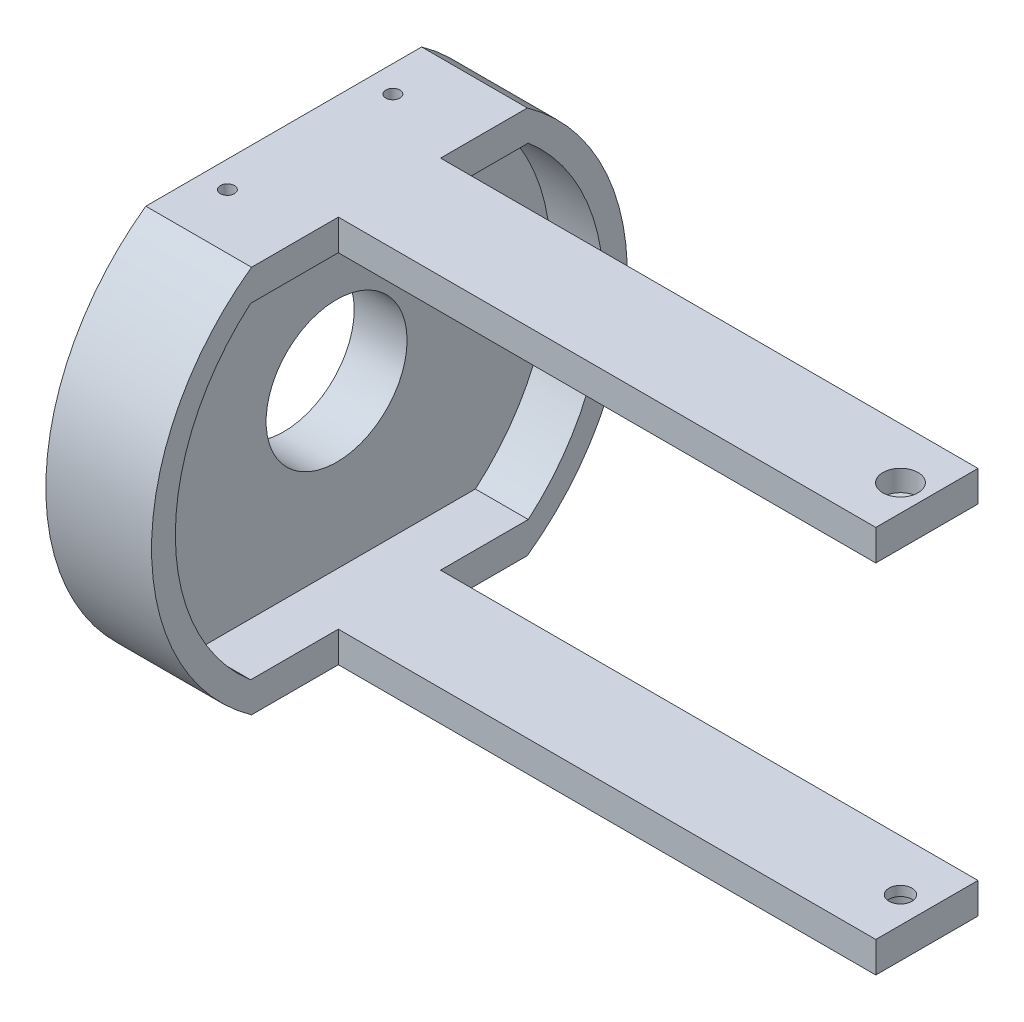
ISO-10303-21;
HEADER;
FILE_DESCRIPTION(('STEP AP214'),'2;1');
FILE_NAME('part.step','',(''),(''),'','','');
FILE_SCHEMA(('AUTOMOTIVE_DESIGN { 1 0 10303 214 1 1 1 1 }'));
ENDSEC;
DATA;
#1=APPLICATION_CONTEXT('core data for automotive mechanical design processes');
#2=APPLICATION_PROTOCOL_DEFINITION('international standard','automotive_design',2000,#1);
#3=PRODUCT_CONTEXT('',#1,'mechanical');
#4=PRODUCT('Part','Part','',(#3));
#5=PRODUCT_RELATED_PRODUCT_CATEGORY('part','',(#4));
#6=PRODUCT_DEFINITION_FORMATION('','',#4);
#7=PRODUCT_DEFINITION_CONTEXT('part definition',#1,'design');
#8=PRODUCT_DEFINITION('design','',#6,#7);
#9=PRODUCT_DEFINITION_SHAPE('','',#8);
#10=(LENGTH_UNIT() NAMED_UNIT(*) SI_UNIT(.MILLI.,.METRE.));
#11=(NAMED_UNIT(*) PLANE_ANGLE_UNIT() SI_UNIT($,.RADIAN.));
#12=(NAMED_UNIT(*) SI_UNIT($,.STERADIAN.) SOLID_ANGLE_UNIT());
#13=UNCERTAINTY_MEASURE_WITH_UNIT(LENGTH_MEASURE(1.E-05),#10,'distance_accuracy_value','');
#14=(GEOMETRIC_REPRESENTATION_CONTEXT(3) GLOBAL_UNCERTAINTY_ASSIGNED_CONTEXT((#13)) GLOBAL_UNIT_ASSIGNED_CONTEXT((#10,
#11,#12)) REPRESENTATION_CONTEXT('',''));
#15=CARTESIAN_POINT('',(0.,0.,0.));
#16=DIRECTION('',(0.,0.,1.));
#17=DIRECTION('',(1.,0.,0.));
#18=AXIS2_PLACEMENT_3D('',#15,#16,#17);
#19=CARTESIAN_POINT('',(6.,0.,0.));
#20=DIRECTION('',(1.,0.,0.));
#21=DIRECTION('',(0.,0.,-1.));
#22=AXIS2_PLACEMENT_3D('',#19,#20,#21);
#23=PLANE('',#22);
#24=DIRECTION('',(0.,0.,-1.));
#25=VECTOR('',#24,1.);
#26=CARTESIAN_POINT('',(6.,-11.,0.));
#27=LINE('',#26,#25);
#28=CARTESIAN_POINT('',(6.,-11.,7.82623792124926));
#29=VERTEX_POINT('',#28);
#30=CARTESIAN_POINT('',(6.,-11.,2.9));
#31=VERTEX_POINT('',#30);
#32=EDGE_CURVE('E265',#29,#31,#27,.T.);
#33=ORIENTED_EDGE('',*,*,#32,.T.);
#34=DIRECTION('',(0.,1.,0.));
#35=VECTOR('',#34,1.);
#36=CARTESIAN_POINT('',(6.,0.,2.9));
#37=LINE('',#36,#35);
#38=CARTESIAN_POINT('',(6.,-9.25,2.9));
#39=VERTEX_POINT('',#38);
#40=EDGE_CURVE('E80',#31,#39,#37,.T.);
#41=ORIENTED_EDGE('',*,*,#40,.T.);
#42=DIRECTION('',(0.,0.,-1.));
#43=VECTOR('',#42,1.);
#44=CARTESIAN_POINT('',(6.,-9.25,0.));
#45=LINE('',#44,#43);
#46=CARTESIAN_POINT('',(6.,-9.25,7.87781695649246));
#47=VERTEX_POINT('',#46);
#48=EDGE_CURVE('E191',#47,#39,#45,.T.);
#49=ORIENTED_EDGE('',*,*,#48,.F.);
#50=CARTESIAN_POINT('',(6.,0.,0.));
#51=DIRECTION('',(1.,0.,0.));
#52=DIRECTION('',(0.,0.,-1.));
#53=AXIS2_PLACEMENT_3D('',#50,#51,#52);
#54=CIRCLE('',#53,12.15);
#55=CARTESIAN_POINT('',(6.,9.25,7.87781695649245));
#56=VERTEX_POINT('',#55);
#57=EDGE_CURVE('E258',#56,#47,#54,.T.);
#58=ORIENTED_EDGE('',*,*,#57,.F.);
#59=DIRECTION('',(0.,0.,-1.));
#60=VECTOR('',#59,1.);
#61=CARTESIAN_POINT('',(6.,9.25,0.));
#62=LINE('',#61,#60);
#63=CARTESIAN_POINT('',(6.,9.25,2.9));
#64=VERTEX_POINT('',#63);
#65=EDGE_CURVE('E262',#56,#64,#62,.T.);
#66=ORIENTED_EDGE('',*,*,#65,.T.);
#67=DIRECTION('',(0.,-1.,0.));
#68=VECTOR('',#67,1.);
#69=CARTESIAN_POINT('',(6.,0.,2.9));
#70=LINE('',#69,#68);
#71=CARTESIAN_POINT('',(6.,11.,2.9));
#72=VERTEX_POINT('',#71);
#73=EDGE_CURVE('E94',#72,#64,#70,.T.);
#74=ORIENTED_EDGE('',*,*,#73,.F.);
#75=DIRECTION('',(0.,0.,1.));
#76=VECTOR('',#75,1.);
#77=CARTESIAN_POINT('',(6.,11.,0.));
#78=LINE('',#77,#76);
#79=CARTESIAN_POINT('',(6.,11.,7.82623792124926));
#80=VERTEX_POINT('',#79);
#81=EDGE_CURVE('E271',#72,#80,#78,.T.);
#82=ORIENTED_EDGE('',*,*,#81,.T.);
#83=CARTESIAN_POINT('',(6.,0.,0.));
#84=DIRECTION('',(1.,0.,0.));
#85=DIRECTION('',(0.,0.,-1.));
#86=AXIS2_PLACEMENT_3D('',#83,#84,#85);
#87=CIRCLE('',#86,13.5);
#88=EDGE_CURVE('E274',#80,#29,#87,.T.);
#89=ORIENTED_EDGE('',*,*,#88,.T.);
#90=EDGE_LOOP('',(#33,#41,#49,#58,#66,#74,#82,#89));
#91=FACE_BOUND('',#90,.T.);
#92=ADVANCED_FACE('F71',(#91),#23,.T.);
#93=CARTESIAN_POINT('',(35.,-27.7079490772959,0.));
#94=DIRECTION('',(0.,1.,0.));
#95=DIRECTION('',(0.,0.,1.));
#96=AXIS2_PLACEMENT_3D('',#93,#94,#95);
#97=CYLINDRICAL_SURFACE('',#96,0.649999999999997);
#98=CARTESIAN_POINT('',(35.,9.25,0.));
#99=DIRECTION('',(0.,1.,0.));
#100=DIRECTION('',(0.,0.,1.));
#101=AXIS2_PLACEMENT_3D('',#98,#99,#100);
#102=CIRCLE('',#101,0.649999999999997);
#103=CARTESIAN_POINT('',(35.,9.25,0.64999999999999));
#104=VERTEX_POINT('',#103);
#105=EDGE_CURVE('E230',#104,#104,#102,.F.);
#106=ORIENTED_EDGE('',*,*,#105,.T.);
#107=EDGE_LOOP('',(#106));
#108=FACE_BOUND('',#107,.T.);
#109=CARTESIAN_POINT('',(35.,9.8,0.));
#110=DIRECTION('',(0.,1.,0.));
#111=DIRECTION('',(0.,0.,1.));
#112=AXIS2_PLACEMENT_3D('',#109,#110,#111);
#113=CIRCLE('',#112,0.649999999999997);
#114=CARTESIAN_POINT('',(35.,9.8,0.64999999999999));
#115=VERTEX_POINT('',#114);
#116=EDGE_CURVE('E224',#115,#115,#113,.F.);
#117=ORIENTED_EDGE('',*,*,#116,.F.);
#118=EDGE_LOOP('',(#117));
#119=FACE_BOUND('',#118,.T.);
#120=ADVANCED_FACE('F399',(#108,#119),#97,.F.);
#121=CARTESIAN_POINT('',(3.,11.,0.));
#122=DIRECTION('',(0.,1.,0.));
#123=DIRECTION('',(0.,0.,1.));
#124=AXIS2_PLACEMENT_3D('',#121,#122,#123);
#125=PLANE('',#124);
#126=CARTESIAN_POINT('',(1.5,11.,4.69574275274956));
#127=DIRECTION('',(0.,1.,0.));
#128=DIRECTION('',(0.,0.,1.));
#129=AXIS2_PLACEMENT_3D('',#126,#127,#128);
#130=CIRCLE('',#129,0.4);
#131=CARTESIAN_POINT('',(1.5,11.,5.09574275274956));
#132=VERTEX_POINT('',#131);
#133=EDGE_CURVE('E443',#132,#132,#130,.T.);
#134=ORIENTED_EDGE('',*,*,#133,.F.);
#135=EDGE_LOOP('',(#134));
#136=FACE_BOUND('',#135,.T.);
#137=CARTESIAN_POINT('',(1.5,11.,-4.69574275274956));
#138=DIRECTION('',(0.,1.,0.));
#139=DIRECTION('',(0.,0.,1.));
#140=AXIS2_PLACEMENT_3D('',#137,#138,#139);
#141=CIRCLE('',#140,0.4);
#142=CARTESIAN_POINT('',(1.5,11.,-4.29574275274956));
#143=VERTEX_POINT('',#142);
#144=EDGE_CURVE('E447',#143,#143,#141,.T.);
#145=ORIENTED_EDGE('',*,*,#144,.F.);
#146=EDGE_LOOP('',(#145));
#147=FACE_BOUND('',#146,.T.);
#148=CARTESIAN_POINT('',(35.,11.,0.));
#149=DIRECTION('',(0.,1.,0.));
#150=DIRECTION('',(0.,0.,1.));
#151=AXIS2_PLACEMENT_3D('',#148,#149,#150);
#152=CIRCLE('',#151,0.999999999999998);
#153=CARTESIAN_POINT('',(35.,11.,0.999999999999991));
#154=VERTEX_POINT('',#153);
#155=EDGE_CURVE('E204',#154,#154,#152,.T.);
#156=ORIENTED_EDGE('',*,*,#155,.F.);
#157=EDGE_LOOP('',(#156));
#158=FACE_BOUND('',#157,.T.);
#159=ORIENTED_EDGE('',*,*,#81,.F.);
#160=DIRECTION('',(1.,0.,0.));
#161=VECTOR('',#160,1.);
#162=CARTESIAN_POINT('',(0.,11.,2.9));
#163=LINE('',#162,#161);
#164=CARTESIAN_POINT('',(36.5,11.,2.9));
#165=VERTEX_POINT('',#164);
#166=EDGE_CURVE('E242',#72,#165,#163,.T.);
#167=ORIENTED_EDGE('',*,*,#166,.T.);
#168=DIRECTION('',(0.,0.,-1.));
#169=VECTOR('',#168,1.);
#170=CARTESIAN_POINT('',(36.5,11.,2.9));
#171=LINE('',#170,#169);
#172=CARTESIAN_POINT('',(36.5,11.,-2.9));
#173=VERTEX_POINT('',#172);
#174=EDGE_CURVE('E239',#165,#173,#171,.T.);
#175=ORIENTED_EDGE('',*,*,#174,.T.);
#176=DIRECTION('',(1.,0.,0.));
#177=VECTOR('',#176,1.);
#178=CARTESIAN_POINT('',(0.,11.,-2.9));
#179=LINE('',#178,#177);
#180=CARTESIAN_POINT('',(6.,11.,-2.9));
#181=VERTEX_POINT('',#180);
#182=EDGE_CURVE('E237',#181,#173,#179,.T.);
#183=ORIENTED_EDGE('',*,*,#182,.F.);
#184=CARTESIAN_POINT('',(6.,11.,-7.82623792124926));
#185=VERTEX_POINT('',#184);
#186=EDGE_CURVE('E272',#185,#181,#78,.T.);
#187=ORIENTED_EDGE('',*,*,#186,.F.);
#188=DIRECTION('',(-1.,0.,0.));
#189=VECTOR('',#188,1.);
#190=CARTESIAN_POINT('',(3.,11.,-7.82623792124926));
#191=LINE('',#190,#189);
#192=CARTESIAN_POINT('',(0.,11.,-7.82623792124926));
#193=VERTEX_POINT('',#192);
#194=EDGE_CURVE('E299',#185,#193,#191,.T.);
#195=ORIENTED_EDGE('',*,*,#194,.T.);
#196=DIRECTION('',(0.,0.,-1.));
#197=VECTOR('',#196,1.);
#198=CARTESIAN_POINT('',(0.,11.,0.));
#199=LINE('',#198,#197);
#200=CARTESIAN_POINT('',(0.,11.,7.82623792124926));
#201=VERTEX_POINT('',#200);
#202=EDGE_CURVE('E303',#201,#193,#199,.T.);
#203=ORIENTED_EDGE('',*,*,#202,.F.);
#204=DIRECTION('',(-1.,0.,0.));
#205=VECTOR('',#204,1.);
#206=CARTESIAN_POINT('',(3.,11.,7.82623792124926));
#207=LINE('',#206,#205);
#208=EDGE_CURVE('E318',#80,#201,#207,.T.);
#209=ORIENTED_EDGE('',*,*,#208,.F.);
#210=EDGE_LOOP('',(#159,#167,#175,#183,#187,#195,#203,#209));
#211=FACE_BOUND('',#210,.T.);
#212=ADVANCED_FACE('F367',(#136,#147,#158,#211),#125,.T.);
#213=CARTESIAN_POINT('',(3.,0.,0.));
#214=DIRECTION('',(-1.,0.,0.));
#215=DIRECTION('',(0.,0.,1.));
#216=AXIS2_PLACEMENT_3D('',#213,#214,#215);
#217=CYLINDRICAL_SURFACE('',#216,13.5);
#218=CARTESIAN_POINT('',(0.,0.,0.));
#219=DIRECTION('',(1.,0.,0.));
#220=DIRECTION('',(0.,0.,-1.));
#221=AXIS2_PLACEMENT_3D('',#218,#219,#220);
#222=CIRCLE('',#221,13.5);
#223=CARTESIAN_POINT('',(0.,-11.,7.82623792124926));
#224=VERTEX_POINT('',#223);
#225=EDGE_CURVE('E305',#201,#224,#222,.T.);
#226=ORIENTED_EDGE('',*,*,#225,.T.);
#227=DIRECTION('',(-1.,0.,0.));
#228=VECTOR('',#227,1.);
#229=CARTESIAN_POINT('',(3.,-11.,7.82623792124926));
#230=LINE('',#229,#228);
#231=EDGE_CURVE('E315',#29,#224,#230,.T.);
#232=ORIENTED_EDGE('',*,*,#231,.F.);
#233=ORIENTED_EDGE('',*,*,#88,.F.);
#234=ORIENTED_EDGE('',*,*,#208,.T.);
#235=EDGE_LOOP('',(#226,#232,#233,#234));
#236=FACE_BOUND('',#235,.T.);
#237=ADVANCED_FACE('F373',(#236),#217,.T.);
#238=CARTESIAN_POINT('',(3.,-11.,0.));
#239=DIRECTION('',(0.,1.,0.));
#240=DIRECTION('',(0.,0.,1.));
#241=AXIS2_PLACEMENT_3D('',#238,#239,#240);
#242=PLANE('',#241);
#243=CARTESIAN_POINT('',(35.,-11.,0.));
#244=DIRECTION('',(0.,1.,0.));
#245=DIRECTION('',(0.,0.,1.));
#246=AXIS2_PLACEMENT_3D('',#243,#244,#245);
#247=CIRCLE('',#246,0.999999999999998);
#248=CARTESIAN_POINT('',(35.,-11.,0.999999999999991));
#249=VERTEX_POINT('',#248);
#250=EDGE_CURVE('E495',#249,#249,#247,.T.);
#251=ORIENTED_EDGE('',*,*,#250,.T.);
#252=EDGE_LOOP('',(#251));
#253=FACE_BOUND('',#252,.T.);
#254=CARTESIAN_POINT('',(6.,-11.,-2.9));
#255=VERTEX_POINT('',#254);
#256=CARTESIAN_POINT('',(6.,-11.,-7.82623792124926));
#257=VERTEX_POINT('',#256);
#258=EDGE_CURVE('E264',#255,#257,#27,.T.);
#259=ORIENTED_EDGE('',*,*,#258,.F.);
#260=DIRECTION('',(1.,0.,0.));
#261=VECTOR('',#260,1.);
#262=CARTESIAN_POINT('',(3.,-11.,-2.9));
#263=LINE('',#262,#261);
#264=CARTESIAN_POINT('',(36.5,-11.,-2.9));
#265=VERTEX_POINT('',#264);
#266=EDGE_CURVE('E194',#255,#265,#263,.T.);
#267=ORIENTED_EDGE('',*,*,#266,.T.);
#268=DIRECTION('',(0.,0.,-1.));
#269=VECTOR('',#268,1.);
#270=CARTESIAN_POINT('',(36.5,-11.,0.));
#271=LINE('',#270,#269);
#272=CARTESIAN_POINT('',(36.5,-11.,2.9));
#273=VERTEX_POINT('',#272);
#274=EDGE_CURVE('E215',#273,#265,#271,.T.);
#275=ORIENTED_EDGE('',*,*,#274,.F.);
#276=DIRECTION('',(1.,0.,0.));
#277=VECTOR('',#276,1.);
#278=CARTESIAN_POINT('',(3.,-11.,2.9));
#279=LINE('',#278,#277);
#280=EDGE_CURVE('E200',#31,#273,#279,.T.);
#281=ORIENTED_EDGE('',*,*,#280,.F.);
#282=ORIENTED_EDGE('',*,*,#32,.F.);
#283=ORIENTED_EDGE('',*,*,#231,.T.);
#284=DIRECTION('',(0.,0.,-1.));
#285=VECTOR('',#284,1.);
#286=CARTESIAN_POINT('',(0.,-11.,0.));
#287=LINE('',#286,#285);
#288=CARTESIAN_POINT('',(0.,-11.,-7.82623792124926));
#289=VERTEX_POINT('',#288);
#290=EDGE_CURVE('E308',#224,#289,#287,.T.);
#291=ORIENTED_EDGE('',*,*,#290,.T.);
#292=DIRECTION('',(-1.,0.,0.));
#293=VECTOR('',#292,1.);
#294=CARTESIAN_POINT('',(3.,-11.,-7.82623792124926));
#295=LINE('',#294,#293);
#296=EDGE_CURVE('E312',#257,#289,#295,.T.);
#297=ORIENTED_EDGE('',*,*,#296,.F.);
#298=EDGE_LOOP('',(#259,#267,#275,#281,#282,#283,#291,#297));
#299=FACE_BOUND('',#298,.T.);
#300=ADVANCED_FACE('F330',(#253,#299),#242,.F.);
#301=CARTESIAN_POINT('',(3.,0.,0.));
#302=DIRECTION('',(-1.,0.,0.));
#303=DIRECTION('',(0.,0.,1.));
#304=AXIS2_PLACEMENT_3D('',#301,#302,#303);
#305=CYLINDRICAL_SURFACE('',#304,4.);
#306=CARTESIAN_POINT('',(3.,0.,0.));
#307=DIRECTION('',(1.,0.,0.));
#308=DIRECTION('',(0.,0.,-1.));
#309=AXIS2_PLACEMENT_3D('',#306,#307,#308);
#310=CIRCLE('',#309,4.);
#311=CARTESIAN_POINT('',(3.,0.,-4.));
#312=VERTEX_POINT('',#311);
#313=EDGE_CURVE('E296',#312,#312,#310,.T.);
#314=ORIENTED_EDGE('',*,*,#313,.T.);
#315=EDGE_LOOP('',(#314));
#316=FACE_BOUND('',#315,.T.);
#317=CARTESIAN_POINT('',(0.,0.,0.));
#318=DIRECTION('',(1.,0.,0.));
#319=DIRECTION('',(0.,0.,-1.));
#320=AXIS2_PLACEMENT_3D('',#317,#318,#319);
#321=CIRCLE('',#320,4.);
#322=CARTESIAN_POINT('',(0.,0.,-4.));
#323=VERTEX_POINT('',#322);
#324=EDGE_CURVE('E295',#323,#323,#321,.T.);
#325=ORIENTED_EDGE('',*,*,#324,.F.);
#326=EDGE_LOOP('',(#325));
#327=FACE_BOUND('',#326,.T.);
#328=ADVANCED_FACE('F73',(#316,#327),#305,.F.);
#329=EDGE_CURVE('E300',#289,#193,#222,.T.);
#330=ORIENTED_EDGE('',*,*,#329,.T.);
#331=ORIENTED_EDGE('',*,*,#194,.F.);
#332=CARTESIAN_POINT('',(6.,0.,0.));
#333=DIRECTION('',(1.,0.,0.));
#334=DIRECTION('',(0.,0.,-1.));
#335=AXIS2_PLACEMENT_3D('',#332,#333,#334);
#336=CIRCLE('',#335,13.5);
#337=EDGE_CURVE('E268',#257,#185,#336,.T.);
#338=ORIENTED_EDGE('',*,*,#337,.F.);
#339=ORIENTED_EDGE('',*,*,#296,.T.);
#340=EDGE_LOOP('',(#330,#331,#338,#339));
#341=FACE_BOUND('',#340,.T.);
#342=ADVANCED_FACE('F381',(#341),#217,.T.);
#343=CARTESIAN_POINT('',(3.,0.,0.));
#344=DIRECTION('',(1.,0.,0.));
#345=DIRECTION('',(0.,0.,-1.));
#346=AXIS2_PLACEMENT_3D('',#343,#344,#345);
#347=PLANE('',#346);
#348=CARTESIAN_POINT('',(3.,0.,0.));
#349=DIRECTION('',(1.,0.,0.));
#350=DIRECTION('',(0.,0.,-1.));
#351=AXIS2_PLACEMENT_3D('',#348,#349,#350);
#352=CIRCLE('',#351,12.15);
#353=CARTESIAN_POINT('',(3.,-9.25,-7.87781695649246));
#354=VERTEX_POINT('',#353);
#355=CARTESIAN_POINT('',(3.,9.25,-7.87781695649245));
#356=VERTEX_POINT('',#355);
#357=EDGE_CURVE('E251',#354,#356,#352,.T.);
#358=ORIENTED_EDGE('',*,*,#357,.T.);
#359=DIRECTION('',(0.,0.,-1.));
#360=VECTOR('',#359,1.);
#361=CARTESIAN_POINT('',(3.,9.25,0.));
#362=LINE('',#361,#360);
#363=CARTESIAN_POINT('',(3.,9.25,7.87781695649245));
#364=VERTEX_POINT('',#363);
#365=EDGE_CURVE('E256',#364,#356,#362,.T.);
#366=ORIENTED_EDGE('',*,*,#365,.F.);
#367=CARTESIAN_POINT('',(3.,0.,0.));
#368=DIRECTION('',(1.,0.,0.));
#369=DIRECTION('',(0.,0.,-1.));
#370=AXIS2_PLACEMENT_3D('',#367,#368,#369);
#371=CIRCLE('',#370,12.15);
#372=CARTESIAN_POINT('',(3.,-9.25,7.87781695649246));
#373=VERTEX_POINT('',#372);
#374=EDGE_CURVE('E282',#364,#373,#371,.T.);
#375=ORIENTED_EDGE('',*,*,#374,.T.);
#376=DIRECTION('',(0.,0.,-1.));
#377=VECTOR('',#376,1.);
#378=CARTESIAN_POINT('',(3.,-9.25,0.));
#379=LINE('',#378,#377);
#380=EDGE_CURVE('E280',#373,#354,#379,.T.);
#381=ORIENTED_EDGE('',*,*,#380,.T.);
#382=EDGE_LOOP('',(#358,#366,#375,#381));
#383=FACE_BOUND('',#382,.T.);
#384=ORIENTED_EDGE('',*,*,#313,.F.);
#385=EDGE_LOOP('',(#384));
#386=FACE_BOUND('',#385,.T.);
#387=ADVANCED_FACE('F347',(#383,#386),#347,.T.);
#388=CARTESIAN_POINT('',(0.,0.,0.));
#389=DIRECTION('',(1.,0.,0.));
#390=DIRECTION('',(0.,0.,-1.));
#391=AXIS2_PLACEMENT_3D('',#388,#389,#390);
#392=PLANE('',#391);
#393=ORIENTED_EDGE('',*,*,#324,.T.);
#394=EDGE_LOOP('',(#393));
#395=FACE_BOUND('',#394,.T.);
#396=ORIENTED_EDGE('',*,*,#329,.F.);
#397=ORIENTED_EDGE('',*,*,#290,.F.);
#398=ORIENTED_EDGE('',*,*,#225,.F.);
#399=ORIENTED_EDGE('',*,*,#202,.T.);
#400=EDGE_LOOP('',(#396,#397,#398,#399));
#401=FACE_BOUND('',#400,.T.);
#402=ADVANCED_FACE('F379',(#395,#401),#392,.F.);
#403=CARTESIAN_POINT('',(6.,0.,0.));
#404=DIRECTION('',(-1.,0.,0.));
#405=DIRECTION('',(0.,0.,1.));
#406=AXIS2_PLACEMENT_3D('',#403,#404,#405);
#407=CYLINDRICAL_SURFACE('',#406,12.15);
#408=ORIENTED_EDGE('',*,*,#357,.F.);
#409=DIRECTION('',(-1.,0.,0.));
#410=VECTOR('',#409,1.);
#411=CARTESIAN_POINT('',(6.,-9.25,-7.87781695649246));
#412=LINE('',#411,#410);
#413=CARTESIAN_POINT('',(6.,-9.25,-7.87781695649246));
#414=VERTEX_POINT('',#413);
#415=EDGE_CURVE('E293',#414,#354,#412,.T.);
#416=ORIENTED_EDGE('',*,*,#415,.F.);
#417=CARTESIAN_POINT('',(6.,0.,0.));
#418=DIRECTION('',(1.,0.,0.));
#419=DIRECTION('',(0.,0.,-1.));
#420=AXIS2_PLACEMENT_3D('',#417,#418,#419);
#421=CIRCLE('',#420,12.15);
#422=CARTESIAN_POINT('',(6.,9.25,-7.87781695649245));
#423=VERTEX_POINT('',#422);
#424=EDGE_CURVE('E252',#414,#423,#421,.T.);
#425=ORIENTED_EDGE('',*,*,#424,.T.);
#426=DIRECTION('',(-1.,0.,0.));
#427=VECTOR('',#426,1.);
#428=CARTESIAN_POINT('',(6.,9.25,-7.87781695649245));
#429=LINE('',#428,#427);
#430=EDGE_CURVE('E277',#423,#356,#429,.T.);
#431=ORIENTED_EDGE('',*,*,#430,.T.);
#432=EDGE_LOOP('',(#408,#416,#425,#431));
#433=FACE_BOUND('',#432,.T.);
#434=ADVANCED_FACE('F343',(#433),#407,.F.);
#435=CARTESIAN_POINT('',(6.,-9.25,0.));
#436=DIRECTION('',(0.,1.,0.));
#437=DIRECTION('',(0.,0.,1.));
#438=AXIS2_PLACEMENT_3D('',#435,#436,#437);
#439=PLANE('',#438);
#440=ORIENTED_EDGE('',*,*,#415,.T.);
#441=ORIENTED_EDGE('',*,*,#380,.F.);
#442=DIRECTION('',(-1.,0.,0.));
#443=VECTOR('',#442,1.);
#444=CARTESIAN_POINT('',(6.,-9.25,7.87781695649246));
#445=LINE('',#444,#443);
#446=EDGE_CURVE('E291',#47,#373,#445,.T.);
#447=ORIENTED_EDGE('',*,*,#446,.F.);
#448=ORIENTED_EDGE('',*,*,#48,.T.);
#449=DIRECTION('',(1.,0.,0.));
#450=VECTOR('',#449,1.);
#451=CARTESIAN_POINT('',(3.,-9.25,2.9));
#452=LINE('',#451,#450);
#453=CARTESIAN_POINT('',(36.5,-9.25,2.9));
#454=VERTEX_POINT('',#453);
#455=EDGE_CURVE('E182',#39,#454,#452,.T.);
#456=ORIENTED_EDGE('',*,*,#455,.T.);
#457=DIRECTION('',(0.,0.,-1.));
#458=VECTOR('',#457,1.);
#459=CARTESIAN_POINT('',(36.5,-9.25,0.));
#460=LINE('',#459,#458);
#461=CARTESIAN_POINT('',(36.5,-9.25,-2.9));
#462=VERTEX_POINT('',#461);
#463=EDGE_CURVE('E188',#454,#462,#460,.T.);
#464=ORIENTED_EDGE('',*,*,#463,.T.);
#465=DIRECTION('',(1.,0.,0.));
#466=VECTOR('',#465,1.);
#467=CARTESIAN_POINT('',(3.,-9.25,-2.9));
#468=LINE('',#467,#466);
#469=CARTESIAN_POINT('',(6.,-9.25,-2.9));
#470=VERTEX_POINT('',#469);
#471=EDGE_CURVE('E87',#470,#462,#468,.T.);
#472=ORIENTED_EDGE('',*,*,#471,.F.);
#473=EDGE_CURVE('E255',#470,#414,#45,.T.);
#474=ORIENTED_EDGE('',*,*,#473,.T.);
#475=EDGE_LOOP('',(#440,#441,#447,#448,#456,#464,#472,#474));
#476=FACE_BOUND('',#475,.T.);
#477=CARTESIAN_POINT('',(35.,-9.25,0.));
#478=DIRECTION('',(0.,1.,0.));
#479=DIRECTION('',(0.,0.,1.));
#480=AXIS2_PLACEMENT_3D('',#477,#478,#479);
#481=CIRCLE('',#480,0.649999999999997);
#482=CARTESIAN_POINT('',(35.,-9.25,0.64999999999999));
#483=VERTEX_POINT('',#482);
#484=EDGE_CURVE('E210',#483,#483,#481,.T.);
#485=ORIENTED_EDGE('',*,*,#484,.F.);
#486=EDGE_LOOP('',(#485));
#487=FACE_BOUND('',#486,.T.);
#488=ADVANCED_FACE('F185',(#476,#487),#439,.T.);
#489=CARTESIAN_POINT('',(6.,0.,0.));
#490=DIRECTION('',(-1.,0.,0.));
#491=DIRECTION('',(0.,0.,1.));
#492=AXIS2_PLACEMENT_3D('',#489,#490,#491);
#493=CYLINDRICAL_SURFACE('',#492,12.15);
#494=ORIENTED_EDGE('',*,*,#374,.F.);
#495=DIRECTION('',(-1.,0.,0.));
#496=VECTOR('',#495,1.);
#497=CARTESIAN_POINT('',(6.,9.25,7.87781695649245));
#498=LINE('',#497,#496);
#499=EDGE_CURVE('E288',#56,#364,#498,.T.);
#500=ORIENTED_EDGE('',*,*,#499,.F.);
#501=ORIENTED_EDGE('',*,*,#57,.T.);
#502=ORIENTED_EDGE('',*,*,#446,.T.);
#503=EDGE_LOOP('',(#494,#500,#501,#502));
#504=FACE_BOUND('',#503,.T.);
#505=ADVANCED_FACE('F350',(#504),#493,.F.);
#506=CARTESIAN_POINT('',(6.,9.25,0.));
#507=DIRECTION('',(0.,1.,0.));
#508=DIRECTION('',(0.,0.,1.));
#509=AXIS2_PLACEMENT_3D('',#506,#507,#508);
#510=PLANE('',#509);
#511=ORIENTED_EDGE('',*,*,#365,.T.);
#512=ORIENTED_EDGE('',*,*,#430,.F.);
#513=CARTESIAN_POINT('',(6.,9.25,-2.9));
#514=VERTEX_POINT('',#513);
#515=EDGE_CURVE('E261',#514,#423,#62,.T.);
#516=ORIENTED_EDGE('',*,*,#515,.F.);
#517=DIRECTION('',(-1.,0.,0.));
#518=VECTOR('',#517,1.);
#519=CARTESIAN_POINT('',(0.,9.25,-2.9));
#520=LINE('',#519,#518);
#521=CARTESIAN_POINT('',(36.5,9.25,-2.9));
#522=VERTEX_POINT('',#521);
#523=EDGE_CURVE('E231',#522,#514,#520,.T.);
#524=ORIENTED_EDGE('',*,*,#523,.F.);
#525=DIRECTION('',(0.,0.,1.));
#526=VECTOR('',#525,1.);
#527=CARTESIAN_POINT('',(36.5,9.25,2.9));
#528=LINE('',#527,#526);
#529=CARTESIAN_POINT('',(36.5,9.25,2.9));
#530=VERTEX_POINT('',#529);
#531=EDGE_CURVE('E232',#522,#530,#528,.T.);
#532=ORIENTED_EDGE('',*,*,#531,.T.);
#533=DIRECTION('',(-1.,0.,0.));
#534=VECTOR('',#533,1.);
#535=CARTESIAN_POINT('',(0.,9.25,2.9));
#536=LINE('',#535,#534);
#537=EDGE_CURVE('E227',#530,#64,#536,.T.);
#538=ORIENTED_EDGE('',*,*,#537,.T.);
#539=ORIENTED_EDGE('',*,*,#65,.F.);
#540=ORIENTED_EDGE('',*,*,#499,.T.);
#541=EDGE_LOOP('',(#511,#512,#516,#524,#532,#538,#539,#540));
#542=FACE_BOUND('',#541,.T.);
#543=ORIENTED_EDGE('',*,*,#105,.F.);
#544=EDGE_LOOP('',(#543));
#545=FACE_BOUND('',#544,.T.);
#546=ADVANCED_FACE('F357',(#542,#545),#510,.F.);
#547=DIRECTION('',(0.,1.,0.));
#548=VECTOR('',#547,1.);
#549=CARTESIAN_POINT('',(6.,0.,-2.9));
#550=LINE('',#549,#548);
#551=EDGE_CURVE('E12',#255,#470,#550,.T.);
#552=ORIENTED_EDGE('',*,*,#551,.F.);
#553=ORIENTED_EDGE('',*,*,#258,.T.);
#554=ORIENTED_EDGE('',*,*,#337,.T.);
#555=ORIENTED_EDGE('',*,*,#186,.T.);
#556=DIRECTION('',(0.,-1.,0.));
#557=VECTOR('',#556,1.);
#558=CARTESIAN_POINT('',(6.,0.,-2.9));
#559=LINE('',#558,#557);
#560=EDGE_CURVE('E320',#181,#514,#559,.T.);
#561=ORIENTED_EDGE('',*,*,#560,.T.);
#562=ORIENTED_EDGE('',*,*,#515,.T.);
#563=ORIENTED_EDGE('',*,*,#424,.F.);
#564=ORIENTED_EDGE('',*,*,#473,.F.);
#565=EDGE_LOOP('',(#552,#553,#554,#555,#561,#562,#563,#564));
#566=FACE_BOUND('',#565,.T.);
#567=ADVANCED_FACE('F338',(#566),#23,.T.);
#568=CARTESIAN_POINT('',(0.,-27.7079490772959,2.9));
#569=DIRECTION('',(0.,0.,1.));
#570=DIRECTION('',(1.,0.,0.));
#571=AXIS2_PLACEMENT_3D('',#568,#569,#570);
#572=PLANE('',#571);
#573=ORIENTED_EDGE('',*,*,#166,.F.);
#574=ORIENTED_EDGE('',*,*,#73,.T.);
#575=ORIENTED_EDGE('',*,*,#537,.F.);
#576=DIRECTION('',(0.,1.,0.));
#577=VECTOR('',#576,1.);
#578=CARTESIAN_POINT('',(36.5,-27.7079490772959,2.9));
#579=LINE('',#578,#577);
#580=EDGE_CURVE('E244',#530,#165,#579,.T.);
#581=ORIENTED_EDGE('',*,*,#580,.T.);
#582=EDGE_LOOP('',(#573,#574,#575,#581));
#583=FACE_BOUND('',#582,.T.);
#584=ADVANCED_FACE('F356',(#583),#572,.T.);
#585=CARTESIAN_POINT('',(36.5,-27.7079490772959,2.9));
#586=DIRECTION('',(1.,0.,0.));
#587=DIRECTION('',(0.,0.,-1.));
#588=AXIS2_PLACEMENT_3D('',#585,#586,#587);
#589=PLANE('',#588);
#590=ORIENTED_EDGE('',*,*,#531,.F.);
#591=DIRECTION('',(0.,1.,0.));
#592=VECTOR('',#591,1.);
#593=CARTESIAN_POINT('',(36.5,-27.7079490772959,-2.9));
#594=LINE('',#593,#592);
#595=EDGE_CURVE('E234',#522,#173,#594,.T.);
#596=ORIENTED_EDGE('',*,*,#595,.T.);
#597=ORIENTED_EDGE('',*,*,#174,.F.);
#598=ORIENTED_EDGE('',*,*,#580,.F.);
#599=EDGE_LOOP('',(#590,#596,#597,#598));
#600=FACE_BOUND('',#599,.T.);
#601=ADVANCED_FACE('F364',(#600),#589,.T.);
#602=CARTESIAN_POINT('',(0.,-27.7079490772959,-2.9));
#603=DIRECTION('',(0.,0.,1.));
#604=DIRECTION('',(1.,0.,0.));
#605=AXIS2_PLACEMENT_3D('',#602,#603,#604);
#606=PLANE('',#605);
#607=ORIENTED_EDGE('',*,*,#560,.F.);
#608=ORIENTED_EDGE('',*,*,#182,.T.);
#609=ORIENTED_EDGE('',*,*,#595,.F.);
#610=ORIENTED_EDGE('',*,*,#523,.T.);
#611=EDGE_LOOP('',(#607,#608,#609,#610));
#612=FACE_BOUND('',#611,.T.);
#613=ADVANCED_FACE('F384',(#612),#606,.F.);
#614=CARTESIAN_POINT('',(35.,9.8,0.));
#615=DIRECTION('',(0.,1.,0.));
#616=DIRECTION('',(0.,0.,1.));
#617=AXIS2_PLACEMENT_3D('',#614,#615,#616);
#618=PLANE('',#617);
#619=CARTESIAN_POINT('',(35.,9.8,0.));
#620=DIRECTION('',(0.,1.,0.));
#621=DIRECTION('',(0.,0.,1.));
#622=AXIS2_PLACEMENT_3D('',#619,#620,#621);
#623=CIRCLE('',#622,0.999999999999998);
#624=CARTESIAN_POINT('',(35.,9.8,0.999999999999991));
#625=VERTEX_POINT('',#624);
#626=EDGE_CURVE('E221',#625,#625,#623,.T.);
#627=ORIENTED_EDGE('',*,*,#626,.T.);
#628=EDGE_LOOP('',(#627));
#629=FACE_BOUND('',#628,.T.);
#630=ORIENTED_EDGE('',*,*,#116,.T.);
#631=EDGE_LOOP('',(#630));
#632=FACE_BOUND('',#631,.T.);
#633=ADVANCED_FACE('F386',(#629,#632),#618,.T.);
#634=CARTESIAN_POINT('',(35.,9.8,0.));
#635=DIRECTION('',(0.,1.,0.));
#636=DIRECTION('',(0.,0.,1.));
#637=AXIS2_PLACEMENT_3D('',#634,#635,#636);
#638=CYLINDRICAL_SURFACE('',#637,0.999999999999998);
#639=ORIENTED_EDGE('',*,*,#626,.F.);
#640=EDGE_LOOP('',(#639));
#641=FACE_BOUND('',#640,.T.);
#642=ORIENTED_EDGE('',*,*,#155,.T.);
#643=EDGE_LOOP('',(#642));
#644=FACE_BOUND('',#643,.T.);
#645=ADVANCED_FACE('F393',(#641,#644),#638,.F.);
#646=CARTESIAN_POINT('',(3.,27.7079490772959,-2.9));
#647=DIRECTION('',(0.,0.,-1.));
#648=DIRECTION('',(-1.,0.,0.));
#649=AXIS2_PLACEMENT_3D('',#646,#647,#648);
#650=PLANE('',#649);
#651=ORIENTED_EDGE('',*,*,#266,.F.);
#652=ORIENTED_EDGE('',*,*,#551,.T.);
#653=ORIENTED_EDGE('',*,*,#471,.T.);
#654=DIRECTION('',(0.,-1.,0.));
#655=VECTOR('',#654,1.);
#656=CARTESIAN_POINT('',(36.5,27.7079490772959,-2.9));
#657=LINE('',#656,#655);
#658=EDGE_CURVE('E205',#462,#265,#657,.T.);
#659=ORIENTED_EDGE('',*,*,#658,.T.);
#660=EDGE_LOOP('',(#651,#652,#653,#659));
#661=FACE_BOUND('',#660,.T.);
#662=ADVANCED_FACE('F334',(#661),#650,.T.);
#663=CARTESIAN_POINT('',(36.5,27.7079490772959,0.));
#664=DIRECTION('',(-1.,0.,0.));
#665=DIRECTION('',(0.,0.,1.));
#666=AXIS2_PLACEMENT_3D('',#663,#664,#665);
#667=PLANE('',#666);
#668=ORIENTED_EDGE('',*,*,#463,.F.);
#669=DIRECTION('',(0.,-1.,0.));
#670=VECTOR('',#669,1.);
#671=CARTESIAN_POINT('',(36.5,27.7079490772959,2.9));
#672=LINE('',#671,#670);
#673=EDGE_CURVE('E197',#454,#273,#672,.T.);
#674=ORIENTED_EDGE('',*,*,#673,.T.);
#675=ORIENTED_EDGE('',*,*,#274,.T.);
#676=ORIENTED_EDGE('',*,*,#658,.F.);
#677=EDGE_LOOP('',(#668,#674,#675,#676));
#678=FACE_BOUND('',#677,.T.);
#679=ADVANCED_FACE('F207',(#678),#667,.F.);
#680=CARTESIAN_POINT('',(3.,27.7079490772959,2.9));
#681=DIRECTION('',(0.,0.,-1.));
#682=DIRECTION('',(-1.,0.,0.));
#683=AXIS2_PLACEMENT_3D('',#680,#681,#682);
#684=PLANE('',#683);
#685=ORIENTED_EDGE('',*,*,#40,.F.);
#686=ORIENTED_EDGE('',*,*,#280,.T.);
#687=ORIENTED_EDGE('',*,*,#673,.F.);
#688=ORIENTED_EDGE('',*,*,#455,.F.);
#689=EDGE_LOOP('',(#685,#686,#687,#688));
#690=FACE_BOUND('',#689,.T.);
#691=ADVANCED_FACE('F198',(#690),#684,.F.);
#692=CARTESIAN_POINT('',(35.,27.7079490772959,0.));
#693=DIRECTION('',(0.,-1.,0.));
#694=DIRECTION('',(0.,0.,-1.));
#695=AXIS2_PLACEMENT_3D('',#692,#693,#694);
#696=CYLINDRICAL_SURFACE('',#695,0.649999999999997);
#697=CARTESIAN_POINT('',(35.,-9.8,0.));
#698=DIRECTION('',(0.,1.,0.));
#699=DIRECTION('',(0.,0.,1.));
#700=AXIS2_PLACEMENT_3D('',#697,#698,#699);
#701=CIRCLE('',#700,0.649999999999997);
#702=CARTESIAN_POINT('',(35.,-9.8,0.64999999999999));
#703=VERTEX_POINT('',#702);
#704=EDGE_CURVE('E75',#703,#703,#701,.T.);
#705=ORIENTED_EDGE('',*,*,#704,.F.);
#706=EDGE_LOOP('',(#705));
#707=FACE_BOUND('',#706,.T.);
#708=ORIENTED_EDGE('',*,*,#484,.T.);
#709=EDGE_LOOP('',(#708));
#710=FACE_BOUND('',#709,.T.);
#711=ADVANCED_FACE('F463',(#707,#710),#696,.F.);
#712=CARTESIAN_POINT('',(35.,-9.8,0.));
#713=DIRECTION('',(0.,-1.,0.));
#714=DIRECTION('',(0.,0.,-1.));
#715=AXIS2_PLACEMENT_3D('',#712,#713,#714);
#716=CYLINDRICAL_SURFACE('',#715,0.999999999999998);
#717=CARTESIAN_POINT('',(35.,-9.8,0.));
#718=DIRECTION('',(0.,1.,0.));
#719=DIRECTION('',(0.,0.,1.));
#720=AXIS2_PLACEMENT_3D('',#717,#718,#719);
#721=CIRCLE('',#720,0.999999999999998);
#722=CARTESIAN_POINT('',(35.,-9.8,0.999999999999991));
#723=VERTEX_POINT('',#722);
#724=EDGE_CURVE('E498',#723,#723,#721,.T.);
#725=ORIENTED_EDGE('',*,*,#724,.T.);
#726=EDGE_LOOP('',(#725));
#727=FACE_BOUND('',#726,.T.);
#728=ORIENTED_EDGE('',*,*,#250,.F.);
#729=EDGE_LOOP('',(#728));
#730=FACE_BOUND('',#729,.T.);
#731=ADVANCED_FACE('F466',(#727,#730),#716,.F.);
#732=CARTESIAN_POINT('',(35.,-9.8,0.));
#733=DIRECTION('',(0.,1.,0.));
#734=DIRECTION('',(0.,0.,1.));
#735=AXIS2_PLACEMENT_3D('',#732,#733,#734);
#736=PLANE('',#735);
#737=ORIENTED_EDGE('',*,*,#704,.T.);
#738=EDGE_LOOP('',(#737));
#739=FACE_BOUND('',#738,.T.);
#740=ORIENTED_EDGE('',*,*,#724,.F.);
#741=EDGE_LOOP('',(#740));
#742=FACE_BOUND('',#741,.T.);
#743=ADVANCED_FACE('F470',(#739,#742),#736,.F.);
#744=CARTESIAN_POINT('',(1.5,9.,-4.69574275274956));
#745=DIRECTION('',(0.,1.,0.));
#746=DIRECTION('',(0.,0.,1.));
#747=AXIS2_PLACEMENT_3D('',#744,#745,#746);
#748=CYLINDRICAL_SURFACE('',#747,0.4);
#749=CARTESIAN_POINT('',(1.5,9.,-4.69574275274956));
#750=DIRECTION('',(0.,1.,0.));
#751=DIRECTION('',(0.,0.,1.));
#752=AXIS2_PLACEMENT_3D('',#749,#750,#751);
#753=CIRCLE('',#752,0.4);
#754=CARTESIAN_POINT('',(1.5,9.,-4.29574275274956));
#755=VERTEX_POINT('',#754);
#756=EDGE_CURVE('E502',#755,#755,#753,.T.);
#757=ORIENTED_EDGE('',*,*,#756,.F.);
#758=EDGE_LOOP('',(#757));
#759=FACE_BOUND('',#758,.T.);
#760=ORIENTED_EDGE('',*,*,#144,.T.);
#761=EDGE_LOOP('',(#760));
#762=FACE_BOUND('',#761,.T.);
#763=ADVANCED_FACE('F474',(#759,#762),#748,.F.);
#764=CARTESIAN_POINT('',(1.5,9.,-4.69574275274956));
#765=DIRECTION('',(0.,1.,0.));
#766=DIRECTION('',(0.,0.,1.));
#767=AXIS2_PLACEMENT_3D('',#764,#765,#766);
#768=PLANE('',#767);
#769=ORIENTED_EDGE('',*,*,#756,.T.);
#770=EDGE_LOOP('',(#769));
#771=FACE_BOUND('',#770,.T.);
#772=ADVANCED_FACE('F476',(#771),#768,.T.);
#773=CARTESIAN_POINT('',(1.5,9.,4.69574275274956));
#774=DIRECTION('',(0.,1.,0.));
#775=DIRECTION('',(0.,0.,1.));
#776=AXIS2_PLACEMENT_3D('',#773,#774,#775);
#777=CYLINDRICAL_SURFACE('',#776,0.4);
#778=CARTESIAN_POINT('',(1.5,9.,4.69574275274956));
#779=DIRECTION('',(0.,1.,0.));
#780=DIRECTION('',(0.,0.,1.));
#781=AXIS2_PLACEMENT_3D('',#778,#779,#780);
#782=CIRCLE('',#781,0.4);
#783=CARTESIAN_POINT('',(1.5,9.,5.09574275274956));
#784=VERTEX_POINT('',#783);
#785=EDGE_CURVE('E494',#784,#784,#782,.T.);
#786=ORIENTED_EDGE('',*,*,#785,.F.);
#787=EDGE_LOOP('',(#786));
#788=FACE_BOUND('',#787,.T.);
#789=ORIENTED_EDGE('',*,*,#133,.T.);
#790=EDGE_LOOP('',(#789));
#791=FACE_BOUND('',#790,.T.);
#792=ADVANCED_FACE('F479',(#788,#791),#777,.F.);
#793=CARTESIAN_POINT('',(1.5,9.,4.69574275274956));
#794=DIRECTION('',(0.,1.,0.));
#795=DIRECTION('',(0.,0.,1.));
#796=AXIS2_PLACEMENT_3D('',#793,#794,#795);
#797=PLANE('',#796);
#798=ORIENTED_EDGE('',*,*,#785,.T.);
#799=EDGE_LOOP('',(#798));
#800=FACE_BOUND('',#799,.T.);
#801=ADVANCED_FACE('F486',(#800),#797,.T.);
#802=CLOSED_SHELL('',(#92,#120,#212,#237,#300,#328,#342,#387,#402,#434,#488,#505,#546,#567,#584,
#601,#613,#633,#645,#662,#679,#691,#711,#731,#743,#763,#772,#792,#801));
#803=MANIFOLD_SOLID_BREP('B2',#802);
#804=ADVANCED_BREP_SHAPE_REPRESENTATION('',(#18,#803),#14);
#805=SHAPE_DEFINITION_REPRESENTATION(#9,#804);
ENDSEC;
END-ISO-10303-21;
